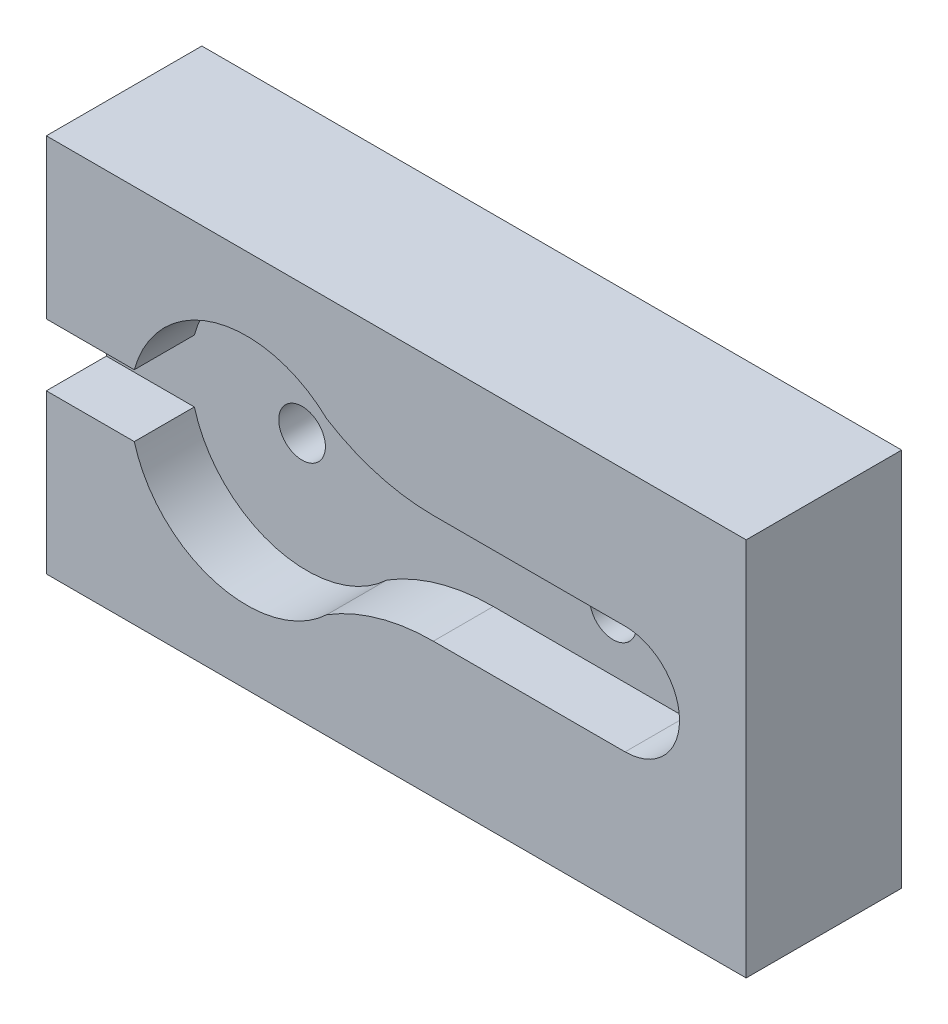
ISO-10303-21;
HEADER;
FILE_DESCRIPTION(('STEP AP214'),'2;1');
FILE_NAME('part.step','',(''),(''),'','','');
FILE_SCHEMA(('AUTOMOTIVE_DESIGN { 1 0 10303 214 1 1 1 1 }'));
ENDSEC;
DATA;
#1=APPLICATION_CONTEXT('core data for automotive mechanical design processes');
#2=APPLICATION_PROTOCOL_DEFINITION('international standard','automotive_design',2000,#1);
#3=PRODUCT_CONTEXT('',#1,'mechanical');
#4=PRODUCT('Part','Part','',(#3));
#5=PRODUCT_RELATED_PRODUCT_CATEGORY('part','',(#4));
#6=PRODUCT_DEFINITION_FORMATION('','',#4);
#7=PRODUCT_DEFINITION_CONTEXT('part definition',#1,'design');
#8=PRODUCT_DEFINITION('design','',#6,#7);
#9=PRODUCT_DEFINITION_SHAPE('','',#8);
#10=(LENGTH_UNIT() NAMED_UNIT(*) SI_UNIT(.MILLI.,.METRE.));
#11=(NAMED_UNIT(*) PLANE_ANGLE_UNIT() SI_UNIT($,.RADIAN.));
#12=(NAMED_UNIT(*) SI_UNIT($,.STERADIAN.) SOLID_ANGLE_UNIT());
#13=UNCERTAINTY_MEASURE_WITH_UNIT(LENGTH_MEASURE(1.E-05),#10,'distance_accuracy_value','');
#14=(GEOMETRIC_REPRESENTATION_CONTEXT(3) GLOBAL_UNCERTAINTY_ASSIGNED_CONTEXT((#13)) GLOBAL_UNIT_ASSIGNED_CONTEXT((#10,
#11,#12)) REPRESENTATION_CONTEXT('',''));
#15=CARTESIAN_POINT('',(0.,0.,0.));
#16=DIRECTION('',(0.,0.,1.));
#17=DIRECTION('',(1.,0.,0.));
#18=AXIS2_PLACEMENT_3D('',#15,#16,#17);
#19=CARTESIAN_POINT('',(-9.6150336666482,0.,6.14));
#20=DIRECTION('',(0.,0.,1.));
#21=DIRECTION('',(1.,0.,0.));
#22=AXIS2_PLACEMENT_3D('',#19,#20,#21);
#23=CYLINDRICAL_SURFACE('',#22,7.50000000000001);
#24=CARTESIAN_POINT('',(-9.6150336666482,0.,10.));
#25=DIRECTION('',(0.,0.,1.));
#26=DIRECTION('',(1.,0.,0.));
#27=AXIS2_PLACEMENT_3D('',#24,#25,#26);
#28=CIRCLE('',#27,7.50000000000001);
#29=CARTESIAN_POINT('',(-4.46146354142918,5.44891869681041,10.));
#30=VERTEX_POINT('',#29);
#31=CARTESIAN_POINT('',(-16.8434498140487,2.,10.));
#32=VERTEX_POINT('',#31);
#33=EDGE_CURVE('E231',#30,#32,#28,.T.);
#34=ORIENTED_EDGE('',*,*,#33,.T.);
#35=DIRECTION('',(0.,0.,1.));
#36=VECTOR('',#35,1.);
#37=CARTESIAN_POINT('',(-16.8434498140487,2.,6.14));
#38=LINE('',#37,#36);
#39=CARTESIAN_POINT('',(-16.8434498140487,2.,6.14));
#40=VERTEX_POINT('',#39);
#41=EDGE_CURVE('E173',#40,#32,#38,.T.);
#42=ORIENTED_EDGE('',*,*,#41,.F.);
#43=CARTESIAN_POINT('',(-9.6150336666482,0.,6.14));
#44=DIRECTION('',(0.,0.,1.));
#45=DIRECTION('',(1.,0.,0.));
#46=AXIS2_PLACEMENT_3D('',#43,#44,#45);
#47=CIRCLE('',#46,7.50000000000001);
#48=CARTESIAN_POINT('',(-4.46146354142918,5.44891869681041,6.14));
#49=VERTEX_POINT('',#48);
#50=EDGE_CURVE('E208',#49,#40,#47,.T.);
#51=ORIENTED_EDGE('',*,*,#50,.F.);
#52=DIRECTION('',(0.,0.,1.));
#53=VECTOR('',#52,1.);
#54=CARTESIAN_POINT('',(-4.46146354142918,5.44891869681041,6.14));
#55=LINE('',#54,#53);
#56=EDGE_CURVE('E227',#49,#30,#55,.T.);
#57=ORIENTED_EDGE('',*,*,#56,.T.);
#58=EDGE_LOOP('',(#34,#42,#51,#57));
#59=FACE_BOUND('',#58,.T.);
#60=ADVANCED_FACE('F44',(#59),#23,.F.);
#61=CARTESIAN_POINT('',(-22.5,-12.2,10.));
#62=DIRECTION('',(0.,1.,0.));
#63=DIRECTION('',(-1.,0.,0.));
#64=AXIS2_PLACEMENT_3D('',#61,#62,#63);
#65=PLANE('',#64);
#66=DIRECTION('',(1.,0.,0.));
#67=VECTOR('',#66,1.);
#68=CARTESIAN_POINT('',(-22.5,-12.2,0.));
#69=LINE('',#68,#67);
#70=CARTESIAN_POINT('',(-22.5,-12.2,0.));
#71=VERTEX_POINT('',#70);
#72=CARTESIAN_POINT('',(22.5,-12.2,0.));
#73=VERTEX_POINT('',#72);
#74=EDGE_CURVE('E253',#71,#73,#69,.T.);
#75=ORIENTED_EDGE('',*,*,#74,.T.);
#76=DIRECTION('',(0.,0.,-1.));
#77=VECTOR('',#76,1.);
#78=CARTESIAN_POINT('',(22.5,-12.2,10.));
#79=LINE('',#78,#77);
#80=CARTESIAN_POINT('',(22.5,-12.2,10.));
#81=VERTEX_POINT('',#80);
#82=EDGE_CURVE('E11',#81,#73,#79,.T.);
#83=ORIENTED_EDGE('',*,*,#82,.F.);
#84=DIRECTION('',(1.,0.,0.));
#85=VECTOR('',#84,1.);
#86=CARTESIAN_POINT('',(-22.5,-12.2,10.));
#87=LINE('',#86,#85);
#88=CARTESIAN_POINT('',(-22.5,-12.2,10.));
#89=VERTEX_POINT('',#88);
#90=EDGE_CURVE('E269',#89,#81,#87,.T.);
#91=ORIENTED_EDGE('',*,*,#90,.F.);
#92=DIRECTION('',(0.,0.,-1.));
#93=VECTOR('',#92,1.);
#94=CARTESIAN_POINT('',(-22.5,-12.2,10.));
#95=LINE('',#94,#93);
#96=EDGE_CURVE('E284',#89,#71,#95,.T.);
#97=ORIENTED_EDGE('',*,*,#96,.T.);
#98=EDGE_LOOP('',(#75,#83,#91,#97));
#99=FACE_BOUND('',#98,.T.);
#100=ADVANCED_FACE('F46',(#99),#65,.F.);
#101=CARTESIAN_POINT('',(22.5,12.2,10.));
#102=DIRECTION('',(-1.,0.,0.));
#103=DIRECTION('',(0.,-1.,0.));
#104=AXIS2_PLACEMENT_3D('',#101,#102,#103);
#105=PLANE('',#104);
#106=DIRECTION('',(0.,1.,0.));
#107=VECTOR('',#106,1.);
#108=CARTESIAN_POINT('',(22.5,12.2,0.));
#109=LINE('',#108,#107);
#110=CARTESIAN_POINT('',(22.5,12.2,0.));
#111=VERTEX_POINT('',#110);
#112=EDGE_CURVE('E288',#73,#111,#109,.T.);
#113=ORIENTED_EDGE('',*,*,#112,.T.);
#114=DIRECTION('',(0.,0.,-1.));
#115=VECTOR('',#114,1.);
#116=CARTESIAN_POINT('',(22.5,12.2,10.));
#117=LINE('',#116,#115);
#118=CARTESIAN_POINT('',(22.5,12.2,10.));
#119=VERTEX_POINT('',#118);
#120=EDGE_CURVE('E53',#119,#111,#117,.T.);
#121=ORIENTED_EDGE('',*,*,#120,.F.);
#122=DIRECTION('',(0.,1.,0.));
#123=VECTOR('',#122,1.);
#124=CARTESIAN_POINT('',(22.5,12.2,10.));
#125=LINE('',#124,#123);
#126=EDGE_CURVE('E273',#81,#119,#125,.T.);
#127=ORIENTED_EDGE('',*,*,#126,.F.);
#128=ORIENTED_EDGE('',*,*,#82,.T.);
#129=EDGE_LOOP('',(#113,#121,#127,#128));
#130=FACE_BOUND('',#129,.T.);
#131=ADVANCED_FACE('F379',(#130),#105,.F.);
#132=CARTESIAN_POINT('',(-22.5,12.2,10.));
#133=DIRECTION('',(0.,-1.,0.));
#134=DIRECTION('',(1.,0.,0.));
#135=AXIS2_PLACEMENT_3D('',#132,#133,#134);
#136=PLANE('',#135);
#137=DIRECTION('',(-1.,0.,0.));
#138=VECTOR('',#137,1.);
#139=CARTESIAN_POINT('',(-22.5,12.2,0.));
#140=LINE('',#139,#138);
#141=CARTESIAN_POINT('',(-22.5,12.2,0.));
#142=VERTEX_POINT('',#141);
#143=EDGE_CURVE('E291',#111,#142,#140,.T.);
#144=ORIENTED_EDGE('',*,*,#143,.T.);
#145=DIRECTION('',(0.,0.,-1.));
#146=VECTOR('',#145,1.);
#147=CARTESIAN_POINT('',(-22.5,12.2,10.));
#148=LINE('',#147,#146);
#149=CARTESIAN_POINT('',(-22.5,12.2,10.));
#150=VERTEX_POINT('',#149);
#151=EDGE_CURVE('E299',#150,#142,#148,.T.);
#152=ORIENTED_EDGE('',*,*,#151,.F.);
#153=DIRECTION('',(-1.,0.,0.));
#154=VECTOR('',#153,1.);
#155=CARTESIAN_POINT('',(-22.5,12.2,10.));
#156=LINE('',#155,#154);
#157=EDGE_CURVE('E277',#119,#150,#156,.T.);
#158=ORIENTED_EDGE('',*,*,#157,.F.);
#159=ORIENTED_EDGE('',*,*,#120,.T.);
#160=EDGE_LOOP('',(#144,#152,#158,#159));
#161=FACE_BOUND('',#160,.T.);
#162=ADVANCED_FACE('F308',(#161),#136,.F.);
#163=CARTESIAN_POINT('',(-22.5,12.2,10.));
#164=DIRECTION('',(1.,0.,0.));
#165=DIRECTION('',(0.,1.,0.));
#166=AXIS2_PLACEMENT_3D('',#163,#164,#165);
#167=PLANE('',#166);
#168=DIRECTION('',(0.,-1.,0.));
#169=VECTOR('',#168,1.);
#170=CARTESIAN_POINT('',(-22.5,-2.00000000000001,6.14));
#171=LINE('',#170,#169);
#172=CARTESIAN_POINT('',(-22.5,2.,6.14));
#173=VERTEX_POINT('',#172);
#174=CARTESIAN_POINT('',(-22.5,-2.00000000000001,6.14));
#175=VERTEX_POINT('',#174);
#176=EDGE_CURVE('E153',#173,#175,#171,.T.);
#177=ORIENTED_EDGE('',*,*,#176,.F.);
#178=DIRECTION('',(0.,0.,1.));
#179=VECTOR('',#178,1.);
#180=CARTESIAN_POINT('',(-22.5,2.,6.14));
#181=LINE('',#180,#179);
#182=CARTESIAN_POINT('',(-22.5,2.,10.));
#183=VERTEX_POINT('',#182);
#184=EDGE_CURVE('E195',#173,#183,#181,.T.);
#185=ORIENTED_EDGE('',*,*,#184,.T.);
#186=DIRECTION('',(0.,-1.,0.));
#187=VECTOR('',#186,1.);
#188=CARTESIAN_POINT('',(-22.5,12.2,10.));
#189=LINE('',#188,#187);
#190=EDGE_CURVE('E280',#150,#183,#189,.T.);
#191=ORIENTED_EDGE('',*,*,#190,.F.);
#192=ORIENTED_EDGE('',*,*,#151,.T.);
#193=DIRECTION('',(0.,-1.,0.));
#194=VECTOR('',#193,1.);
#195=CARTESIAN_POINT('',(-22.5,12.2,0.));
#196=LINE('',#195,#194);
#197=EDGE_CURVE('E274',#142,#71,#196,.T.);
#198=ORIENTED_EDGE('',*,*,#197,.T.);
#199=ORIENTED_EDGE('',*,*,#96,.F.);
#200=CARTESIAN_POINT('',(-22.5,-2.00000000000001,10.));
#201=VERTEX_POINT('',#200);
#202=EDGE_CURVE('E168',#201,#89,#189,.T.);
#203=ORIENTED_EDGE('',*,*,#202,.F.);
#204=DIRECTION('',(0.,0.,1.));
#205=VECTOR('',#204,1.);
#206=CARTESIAN_POINT('',(-22.5,-2.00000000000001,6.14));
#207=LINE('',#206,#205);
#208=EDGE_CURVE('E146',#175,#201,#207,.T.);
#209=ORIENTED_EDGE('',*,*,#208,.F.);
#210=EDGE_LOOP('',(#177,#185,#191,#192,#198,#199,#203,#209));
#211=FACE_BOUND('',#210,.T.);
#212=ADVANCED_FACE('F166',(#211),#167,.F.);
#213=CARTESIAN_POINT('',(0.,0.,10.));
#214=DIRECTION('',(0.,0.,-1.));
#215=DIRECTION('',(-1.,0.,0.));
#216=AXIS2_PLACEMENT_3D('',#213,#214,#215);
#217=PLANE('',#216);
#218=ORIENTED_EDGE('',*,*,#190,.T.);
#219=DIRECTION('',(-1.,0.,0.));
#220=VECTOR('',#219,1.);
#221=CARTESIAN_POINT('',(-22.5,2.,10.));
#222=LINE('',#221,#220);
#223=EDGE_CURVE('E163',#32,#183,#222,.T.);
#224=ORIENTED_EDGE('',*,*,#223,.F.);
#225=ORIENTED_EDGE('',*,*,#33,.F.);
#226=CARTESIAN_POINT('',(2.3849663333518,16.5,10.));
#227=DIRECTION('',(0.,0.,-1.));
#228=DIRECTION('',(-1.,0.,0.));
#229=AXIS2_PLACEMENT_3D('',#226,#227,#228);
#230=CIRCLE('',#229,13.);
#231=CARTESIAN_POINT('',(2.38496633335179,3.50000000000001,10.));
#232=VERTEX_POINT('',#231);
#233=EDGE_CURVE('E68',#232,#30,#230,.T.);
#234=ORIENTED_EDGE('',*,*,#233,.F.);
#235=DIRECTION('',(-1.,0.,0.));
#236=VECTOR('',#235,1.);
#237=CARTESIAN_POINT('',(14.7155048933518,3.50000000000001,10.));
#238=LINE('',#237,#236);
#239=CARTESIAN_POINT('',(14.7155048933518,3.50000000000001,10.));
#240=VERTEX_POINT('',#239);
#241=EDGE_CURVE('E207',#240,#232,#238,.T.);
#242=ORIENTED_EDGE('',*,*,#241,.F.);
#243=CARTESIAN_POINT('',(14.7155048933518,0.,10.));
#244=DIRECTION('',(0.,0.,1.));
#245=DIRECTION('',(1.,0.,0.));
#246=AXIS2_PLACEMENT_3D('',#243,#244,#245);
#247=CIRCLE('',#246,3.5);
#248=CARTESIAN_POINT('',(14.7155048933518,-3.49999999999999,10.));
#249=VERTEX_POINT('',#248);
#250=EDGE_CURVE('E243',#249,#240,#247,.T.);
#251=ORIENTED_EDGE('',*,*,#250,.F.);
#252=DIRECTION('',(1.,0.,0.));
#253=VECTOR('',#252,1.);
#254=CARTESIAN_POINT('',(14.7155048933518,-3.49999999999999,10.));
#255=LINE('',#254,#253);
#256=CARTESIAN_POINT('',(2.38496633335179,-3.49999999999999,10.));
#257=VERTEX_POINT('',#256);
#258=EDGE_CURVE('E239',#257,#249,#255,.T.);
#259=ORIENTED_EDGE('',*,*,#258,.F.);
#260=CARTESIAN_POINT('',(2.38496633335181,-16.5,10.));
#261=DIRECTION('',(0.,0.,-1.));
#262=DIRECTION('',(1.,0.,0.));
#263=AXIS2_PLACEMENT_3D('',#260,#261,#262);
#264=CIRCLE('',#263,13.);
#265=CARTESIAN_POINT('',(-4.46146354142917,-5.44891869681041,10.));
#266=VERTEX_POINT('',#265);
#267=EDGE_CURVE('E235',#266,#257,#264,.T.);
#268=ORIENTED_EDGE('',*,*,#267,.F.);
#269=CARTESIAN_POINT('',(-16.8434498140487,-2.00000000000002,10.));
#270=VERTEX_POINT('',#269);
#271=EDGE_CURVE('E230',#270,#266,#28,.T.);
#272=ORIENTED_EDGE('',*,*,#271,.F.);
#273=DIRECTION('',(1.,0.,0.));
#274=VECTOR('',#273,1.);
#275=CARTESIAN_POINT('',(-22.5,-2.00000000000001,10.));
#276=LINE('',#275,#274);
#277=EDGE_CURVE('E322',#201,#270,#276,.T.);
#278=ORIENTED_EDGE('',*,*,#277,.F.);
#279=ORIENTED_EDGE('',*,*,#202,.T.);
#280=ORIENTED_EDGE('',*,*,#90,.T.);
#281=ORIENTED_EDGE('',*,*,#126,.T.);
#282=ORIENTED_EDGE('',*,*,#157,.T.);
#283=EDGE_LOOP('',(#218,#224,#225,#234,#242,#251,#259,#268,#272,#278,#279,#280,#281,#282));
#284=FACE_BOUND('',#283,.T.);
#285=ADVANCED_FACE('F320',(#284),#217,.F.);
#286=CARTESIAN_POINT('',(0.,0.,0.));
#287=DIRECTION('',(0.,0.,-1.));
#288=DIRECTION('',(-1.,0.,0.));
#289=AXIS2_PLACEMENT_3D('',#286,#287,#288);
#290=PLANE('',#289);
#291=CARTESIAN_POINT('',(-9.91503366664821,0.,0.));
#292=DIRECTION('',(0.,0.,1.));
#293=DIRECTION('',(1.,0.,0.));
#294=AXIS2_PLACEMENT_3D('',#291,#292,#293);
#295=CIRCLE('',#294,1.5);
#296=CARTESIAN_POINT('',(-8.41503366664821,0.,0.));
#297=VERTEX_POINT('',#296);
#298=EDGE_CURVE('E191',#297,#297,#295,.T.);
#299=ORIENTED_EDGE('',*,*,#298,.T.);
#300=EDGE_LOOP('',(#299));
#301=FACE_BOUND('',#300,.T.);
#302=CARTESIAN_POINT('',(14.0849663333518,0.,0.));
#303=DIRECTION('',(0.,0.,1.));
#304=DIRECTION('',(1.,0.,0.));
#305=AXIS2_PLACEMENT_3D('',#302,#303,#304);
#306=CIRCLE('',#305,1.5);
#307=CARTESIAN_POINT('',(15.5849663333518,0.,0.));
#308=VERTEX_POINT('',#307);
#309=EDGE_CURVE('E183',#308,#308,#306,.T.);
#310=ORIENTED_EDGE('',*,*,#309,.T.);
#311=EDGE_LOOP('',(#310));
#312=FACE_BOUND('',#311,.T.);
#313=CARTESIAN_POINT('',(10.0849663333518,0.,0.));
#314=DIRECTION('',(0.,0.,1.));
#315=DIRECTION('',(1.,0.,0.));
#316=AXIS2_PLACEMENT_3D('',#313,#314,#315);
#317=CIRCLE('',#316,1.5);
#318=CARTESIAN_POINT('',(11.5849663333518,0.,0.));
#319=VERTEX_POINT('',#318);
#320=EDGE_CURVE('E196',#319,#319,#317,.T.);
#321=ORIENTED_EDGE('',*,*,#320,.T.);
#322=EDGE_LOOP('',(#321));
#323=FACE_BOUND('',#322,.T.);
#324=ORIENTED_EDGE('',*,*,#74,.F.);
#325=ORIENTED_EDGE('',*,*,#197,.F.);
#326=ORIENTED_EDGE('',*,*,#143,.F.);
#327=ORIENTED_EDGE('',*,*,#112,.F.);
#328=EDGE_LOOP('',(#324,#325,#326,#327));
#329=FACE_BOUND('',#328,.T.);
#330=ADVANCED_FACE('F314',(#301,#312,#323,#329),#290,.T.);
#331=CARTESIAN_POINT('',(2.3849663333518,16.5,6.14));
#332=DIRECTION('',(0.,0.,1.));
#333=DIRECTION('',(1.,0.,0.));
#334=AXIS2_PLACEMENT_3D('',#331,#332,#333);
#335=CYLINDRICAL_SURFACE('',#334,13.);
#336=ORIENTED_EDGE('',*,*,#233,.T.);
#337=ORIENTED_EDGE('',*,*,#56,.F.);
#338=CARTESIAN_POINT('',(2.3849663333518,16.5,6.14));
#339=DIRECTION('',(0.,0.,-1.));
#340=DIRECTION('',(-1.,0.,0.));
#341=AXIS2_PLACEMENT_3D('',#338,#339,#340);
#342=CIRCLE('',#341,13.);
#343=CARTESIAN_POINT('',(2.38496633335179,3.50000000000001,6.14));
#344=VERTEX_POINT('',#343);
#345=EDGE_CURVE('E203',#344,#49,#342,.T.);
#346=ORIENTED_EDGE('',*,*,#345,.F.);
#347=DIRECTION('',(0.,0.,1.));
#348=VECTOR('',#347,1.);
#349=CARTESIAN_POINT('',(2.38496633335179,3.50000000000001,6.14));
#350=LINE('',#349,#348);
#351=EDGE_CURVE('E250',#344,#232,#350,.T.);
#352=ORIENTED_EDGE('',*,*,#351,.T.);
#353=EDGE_LOOP('',(#336,#337,#346,#352));
#354=FACE_BOUND('',#353,.T.);
#355=ADVANCED_FACE('F357',(#354),#335,.T.);
#356=CARTESIAN_POINT('',(14.7155048933518,3.50000000000001,6.14));
#357=DIRECTION('',(0.,1.,0.));
#358=DIRECTION('',(0.,0.,1.));
#359=AXIS2_PLACEMENT_3D('',#356,#357,#358);
#360=PLANE('',#359);
#361=ORIENTED_EDGE('',*,*,#241,.T.);
#362=ORIENTED_EDGE('',*,*,#351,.F.);
#363=DIRECTION('',(-1.,0.,0.));
#364=VECTOR('',#363,1.);
#365=CARTESIAN_POINT('',(14.7155048933518,3.50000000000001,6.14));
#366=LINE('',#365,#364);
#367=CARTESIAN_POINT('',(14.7155048933518,3.50000000000001,6.14));
#368=VERTEX_POINT('',#367);
#369=EDGE_CURVE('E223',#368,#344,#366,.T.);
#370=ORIENTED_EDGE('',*,*,#369,.F.);
#371=DIRECTION('',(0.,0.,1.));
#372=VECTOR('',#371,1.);
#373=CARTESIAN_POINT('',(14.7155048933518,3.50000000000001,6.14));
#374=LINE('',#373,#372);
#375=EDGE_CURVE('E254',#368,#240,#374,.T.);
#376=ORIENTED_EDGE('',*,*,#375,.T.);
#377=EDGE_LOOP('',(#361,#362,#370,#376));
#378=FACE_BOUND('',#377,.T.);
#379=ADVANCED_FACE('F354',(#378),#360,.F.);
#380=CARTESIAN_POINT('',(14.7155048933518,0.,6.14));
#381=DIRECTION('',(0.,0.,1.));
#382=DIRECTION('',(1.,0.,0.));
#383=AXIS2_PLACEMENT_3D('',#380,#381,#382);
#384=CYLINDRICAL_SURFACE('',#383,3.5);
#385=ORIENTED_EDGE('',*,*,#250,.T.);
#386=ORIENTED_EDGE('',*,*,#375,.F.);
#387=CARTESIAN_POINT('',(14.7155048933518,0.,6.14));
#388=DIRECTION('',(0.,0.,1.));
#389=DIRECTION('',(1.,0.,0.));
#390=AXIS2_PLACEMENT_3D('',#387,#388,#389);
#391=CIRCLE('',#390,3.5);
#392=CARTESIAN_POINT('',(14.7155048933518,-3.49999999999999,6.14));
#393=VERTEX_POINT('',#392);
#394=EDGE_CURVE('E219',#393,#368,#391,.T.);
#395=ORIENTED_EDGE('',*,*,#394,.F.);
#396=DIRECTION('',(0.,0.,1.));
#397=VECTOR('',#396,1.);
#398=CARTESIAN_POINT('',(14.7155048933518,-3.49999999999999,6.14));
#399=LINE('',#398,#397);
#400=EDGE_CURVE('E257',#393,#249,#399,.T.);
#401=ORIENTED_EDGE('',*,*,#400,.T.);
#402=EDGE_LOOP('',(#385,#386,#395,#401));
#403=FACE_BOUND('',#402,.T.);
#404=ADVANCED_FACE('F351',(#403),#384,.F.);
#405=CARTESIAN_POINT('',(14.7155048933518,-3.49999999999999,6.14));
#406=DIRECTION('',(0.,-1.,0.));
#407=DIRECTION('',(1.,0.,0.));
#408=AXIS2_PLACEMENT_3D('',#405,#406,#407);
#409=PLANE('',#408);
#410=ORIENTED_EDGE('',*,*,#258,.T.);
#411=ORIENTED_EDGE('',*,*,#400,.F.);
#412=DIRECTION('',(1.,0.,0.));
#413=VECTOR('',#412,1.);
#414=CARTESIAN_POINT('',(14.7155048933518,-3.49999999999999,6.14));
#415=LINE('',#414,#413);
#416=CARTESIAN_POINT('',(2.38496633335179,-3.49999999999999,6.14));
#417=VERTEX_POINT('',#416);
#418=EDGE_CURVE('E215',#417,#393,#415,.T.);
#419=ORIENTED_EDGE('',*,*,#418,.F.);
#420=DIRECTION('',(0.,0.,1.));
#421=VECTOR('',#420,1.);
#422=CARTESIAN_POINT('',(2.38496633335179,-3.49999999999999,6.14));
#423=LINE('',#422,#421);
#424=EDGE_CURVE('E260',#417,#257,#423,.T.);
#425=ORIENTED_EDGE('',*,*,#424,.T.);
#426=EDGE_LOOP('',(#410,#411,#419,#425));
#427=FACE_BOUND('',#426,.T.);
#428=ADVANCED_FACE('F349',(#427),#409,.F.);
#429=CARTESIAN_POINT('',(2.38496633335181,-16.5,6.14));
#430=DIRECTION('',(0.,0.,1.));
#431=DIRECTION('',(1.,0.,0.));
#432=AXIS2_PLACEMENT_3D('',#429,#430,#431);
#433=CYLINDRICAL_SURFACE('',#432,13.);
#434=ORIENTED_EDGE('',*,*,#267,.T.);
#435=ORIENTED_EDGE('',*,*,#424,.F.);
#436=CARTESIAN_POINT('',(2.38496633335181,-16.5,6.14));
#437=DIRECTION('',(0.,0.,-1.));
#438=DIRECTION('',(1.,0.,0.));
#439=AXIS2_PLACEMENT_3D('',#436,#437,#438);
#440=CIRCLE('',#439,13.);
#441=CARTESIAN_POINT('',(-4.46146354142917,-5.44891869681041,6.14));
#442=VERTEX_POINT('',#441);
#443=EDGE_CURVE('E211',#442,#417,#440,.T.);
#444=ORIENTED_EDGE('',*,*,#443,.F.);
#445=DIRECTION('',(0.,0.,1.));
#446=VECTOR('',#445,1.);
#447=CARTESIAN_POINT('',(-4.46146354142917,-5.44891869681041,6.14));
#448=LINE('',#447,#446);
#449=EDGE_CURVE('E263',#442,#266,#448,.T.);
#450=ORIENTED_EDGE('',*,*,#449,.T.);
#451=EDGE_LOOP('',(#434,#435,#444,#450));
#452=FACE_BOUND('',#451,.T.);
#453=ADVANCED_FACE('F343',(#452),#433,.T.);
#454=CARTESIAN_POINT('',(-16.8434498140487,-2.00000000000003,6.14));
#455=VERTEX_POINT('',#454);
#456=EDGE_CURVE('E206',#455,#442,#47,.T.);
#457=ORIENTED_EDGE('',*,*,#456,.F.);
#458=DIRECTION('',(0.,0.,1.));
#459=VECTOR('',#458,1.);
#460=CARTESIAN_POINT('',(-16.8434498140487,-2.00000000000002,6.14));
#461=LINE('',#460,#459);
#462=EDGE_CURVE('E149',#455,#270,#461,.T.);
#463=ORIENTED_EDGE('',*,*,#462,.T.);
#464=ORIENTED_EDGE('',*,*,#271,.T.);
#465=ORIENTED_EDGE('',*,*,#449,.F.);
#466=EDGE_LOOP('',(#457,#463,#464,#465));
#467=FACE_BOUND('',#466,.T.);
#468=ADVANCED_FACE('F337',(#467),#23,.F.);
#469=CARTESIAN_POINT('',(2.3849663333518,16.5,6.14));
#470=DIRECTION('',(0.,0.,-1.));
#471=DIRECTION('',(-1.,0.,0.));
#472=AXIS2_PLACEMENT_3D('',#469,#470,#471);
#473=PLANE('',#472);
#474=CARTESIAN_POINT('',(-9.91503366664821,0.,6.14));
#475=DIRECTION('',(0.,0.,1.));
#476=DIRECTION('',(1.,0.,0.));
#477=AXIS2_PLACEMENT_3D('',#474,#475,#476);
#478=CIRCLE('',#477,1.5);
#479=CARTESIAN_POINT('',(-8.41503366664821,0.,6.14));
#480=VERTEX_POINT('',#479);
#481=EDGE_CURVE('E187',#480,#480,#478,.T.);
#482=ORIENTED_EDGE('',*,*,#481,.F.);
#483=EDGE_LOOP('',(#482));
#484=FACE_BOUND('',#483,.T.);
#485=CARTESIAN_POINT('',(14.0849663333518,0.,6.14));
#486=DIRECTION('',(0.,0.,1.));
#487=DIRECTION('',(1.,0.,0.));
#488=AXIS2_PLACEMENT_3D('',#485,#486,#487);
#489=CIRCLE('',#488,1.5);
#490=CARTESIAN_POINT('',(15.5849663333518,0.,6.14));
#491=VERTEX_POINT('',#490);
#492=EDGE_CURVE('E178',#491,#491,#489,.T.);
#493=ORIENTED_EDGE('',*,*,#492,.F.);
#494=EDGE_LOOP('',(#493));
#495=FACE_BOUND('',#494,.T.);
#496=CARTESIAN_POINT('',(10.0849663333518,0.,6.14));
#497=DIRECTION('',(0.,0.,1.));
#498=DIRECTION('',(1.,0.,0.));
#499=AXIS2_PLACEMENT_3D('',#496,#497,#498);
#500=CIRCLE('',#499,1.5);
#501=CARTESIAN_POINT('',(11.5849663333518,0.,6.14));
#502=VERTEX_POINT('',#501);
#503=EDGE_CURVE('E182',#502,#502,#500,.T.);
#504=ORIENTED_EDGE('',*,*,#503,.F.);
#505=EDGE_LOOP('',(#504));
#506=FACE_BOUND('',#505,.T.);
#507=ORIENTED_EDGE('',*,*,#345,.T.);
#508=ORIENTED_EDGE('',*,*,#50,.T.);
#509=DIRECTION('',(-1.,0.,0.));
#510=VECTOR('',#509,1.);
#511=CARTESIAN_POINT('',(-22.5,2.,6.14));
#512=LINE('',#511,#510);
#513=EDGE_CURVE('E152',#40,#173,#512,.T.);
#514=ORIENTED_EDGE('',*,*,#513,.T.);
#515=ORIENTED_EDGE('',*,*,#176,.T.);
#516=DIRECTION('',(1.,0.,0.));
#517=VECTOR('',#516,1.);
#518=CARTESIAN_POINT('',(-22.5,-2.00000000000001,6.14));
#519=LINE('',#518,#517);
#520=EDGE_CURVE('E60',#175,#455,#519,.T.);
#521=ORIENTED_EDGE('',*,*,#520,.T.);
#522=ORIENTED_EDGE('',*,*,#456,.T.);
#523=ORIENTED_EDGE('',*,*,#443,.T.);
#524=ORIENTED_EDGE('',*,*,#418,.T.);
#525=ORIENTED_EDGE('',*,*,#394,.T.);
#526=ORIENTED_EDGE('',*,*,#369,.T.);
#527=EDGE_LOOP('',(#507,#508,#514,#515,#521,#522,#523,#524,#525,#526));
#528=FACE_BOUND('',#527,.T.);
#529=ADVANCED_FACE('F158',(#484,#495,#506,#528),#473,.F.);
#530=CARTESIAN_POINT('',(10.0849663333518,0.,0.));
#531=DIRECTION('',(0.,0.,1.));
#532=DIRECTION('',(1.,0.,0.));
#533=AXIS2_PLACEMENT_3D('',#530,#531,#532);
#534=CYLINDRICAL_SURFACE('',#533,1.5);
#535=ORIENTED_EDGE('',*,*,#320,.F.);
#536=EDGE_LOOP('',(#535));
#537=FACE_BOUND('',#536,.T.);
#538=ORIENTED_EDGE('',*,*,#503,.T.);
#539=EDGE_LOOP('',(#538));
#540=FACE_BOUND('',#539,.T.);
#541=ADVANCED_FACE('F386',(#537,#540),#534,.F.);
#542=CARTESIAN_POINT('',(14.0849663333518,0.,0.));
#543=DIRECTION('',(0.,0.,1.));
#544=DIRECTION('',(1.,0.,0.));
#545=AXIS2_PLACEMENT_3D('',#542,#543,#544);
#546=CYLINDRICAL_SURFACE('',#545,1.5);
#547=ORIENTED_EDGE('',*,*,#309,.F.);
#548=EDGE_LOOP('',(#547));
#549=FACE_BOUND('',#548,.T.);
#550=ORIENTED_EDGE('',*,*,#492,.T.);
#551=EDGE_LOOP('',(#550));
#552=FACE_BOUND('',#551,.T.);
#553=ADVANCED_FACE('F370',(#549,#552),#546,.F.);
#554=CARTESIAN_POINT('',(-9.91503366664821,0.,0.));
#555=DIRECTION('',(0.,0.,1.));
#556=DIRECTION('',(1.,0.,0.));
#557=AXIS2_PLACEMENT_3D('',#554,#555,#556);
#558=CYLINDRICAL_SURFACE('',#557,1.5);
#559=ORIENTED_EDGE('',*,*,#298,.F.);
#560=EDGE_LOOP('',(#559));
#561=FACE_BOUND('',#560,.T.);
#562=ORIENTED_EDGE('',*,*,#481,.T.);
#563=EDGE_LOOP('',(#562));
#564=FACE_BOUND('',#563,.T.);
#565=ADVANCED_FACE('F362',(#561,#564),#558,.F.);
#566=CARTESIAN_POINT('',(-22.5,2.,6.14));
#567=DIRECTION('',(0.,1.,0.));
#568=DIRECTION('',(0.,0.,1.));
#569=AXIS2_PLACEMENT_3D('',#566,#567,#568);
#570=PLANE('',#569);
#571=ORIENTED_EDGE('',*,*,#223,.T.);
#572=ORIENTED_EDGE('',*,*,#184,.F.);
#573=ORIENTED_EDGE('',*,*,#513,.F.);
#574=ORIENTED_EDGE('',*,*,#41,.T.);
#575=EDGE_LOOP('',(#571,#572,#573,#574));
#576=FACE_BOUND('',#575,.T.);
#577=ADVANCED_FACE('F360',(#576),#570,.F.);
#578=CARTESIAN_POINT('',(-22.5,-2.00000000000001,6.14));
#579=DIRECTION('',(0.,-1.,0.));
#580=DIRECTION('',(1.,0.,0.));
#581=AXIS2_PLACEMENT_3D('',#578,#579,#580);
#582=PLANE('',#581);
#583=ORIENTED_EDGE('',*,*,#277,.T.);
#584=ORIENTED_EDGE('',*,*,#462,.F.);
#585=ORIENTED_EDGE('',*,*,#520,.F.);
#586=ORIENTED_EDGE('',*,*,#208,.T.);
#587=EDGE_LOOP('',(#583,#584,#585,#586));
#588=FACE_BOUND('',#587,.T.);
#589=ADVANCED_FACE('F144',(#588),#582,.F.);
#590=CLOSED_SHELL('',(#60,#100,#131,#162,#212,#285,#330,#355,#379,#404,#428,#453,#468,#529,#541,
#553,#565,#577,#589));
#591=MANIFOLD_SOLID_BREP('B2',#590);
#592=ADVANCED_BREP_SHAPE_REPRESENTATION('',(#18,#591),#14);
#593=SHAPE_DEFINITION_REPRESENTATION(#9,#592);
ENDSEC;
END-ISO-10303-21;
